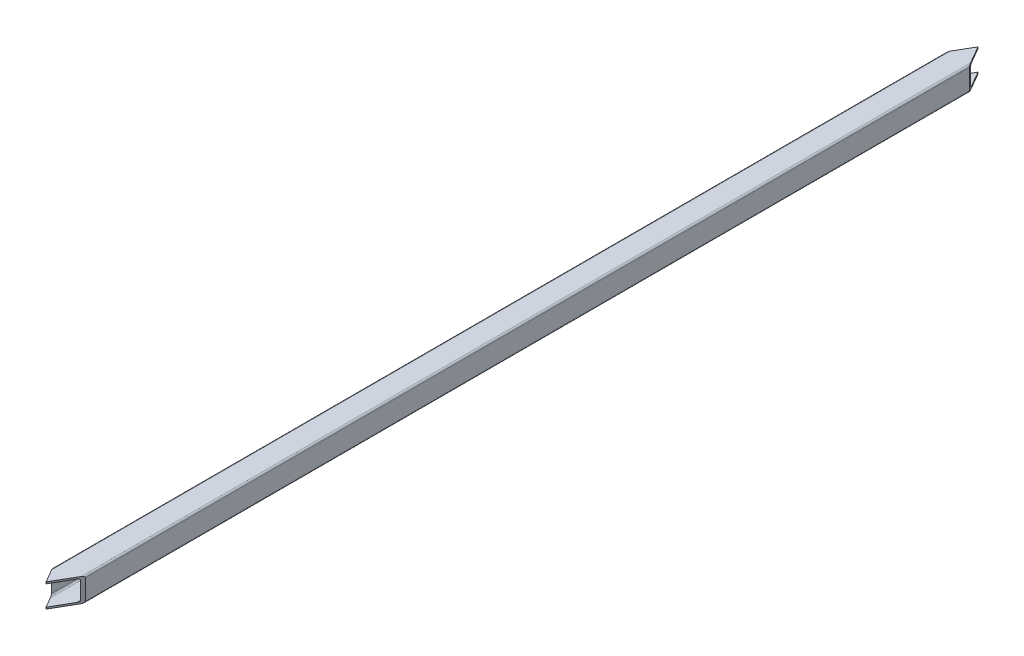
ISO-10303-21;
HEADER;
FILE_DESCRIPTION(('STEP AP214'),'2;1');
FILE_NAME('part.step','',(''),(''),'','','');
FILE_SCHEMA(('AUTOMOTIVE_DESIGN { 1 0 10303 214 1 1 1 1 }'));
ENDSEC;
DATA;
#1=APPLICATION_CONTEXT('core data for automotive mechanical design processes');
#2=APPLICATION_PROTOCOL_DEFINITION('international standard','automotive_design',2000,#1);
#3=PRODUCT_CONTEXT('',#1,'mechanical');
#4=PRODUCT('Part','Part','',(#3));
#5=PRODUCT_RELATED_PRODUCT_CATEGORY('part','',(#4));
#6=PRODUCT_DEFINITION_FORMATION('','',#4);
#7=PRODUCT_DEFINITION_CONTEXT('part definition',#1,'design');
#8=PRODUCT_DEFINITION('design','',#6,#7);
#9=PRODUCT_DEFINITION_SHAPE('','',#8);
#10=(LENGTH_UNIT() NAMED_UNIT(*) SI_UNIT(.MILLI.,.METRE.));
#11=(NAMED_UNIT(*) PLANE_ANGLE_UNIT() SI_UNIT($,.RADIAN.));
#12=(NAMED_UNIT(*) SI_UNIT($,.STERADIAN.) SOLID_ANGLE_UNIT());
#13=UNCERTAINTY_MEASURE_WITH_UNIT(LENGTH_MEASURE(1.E-05),#10,'distance_accuracy_value','');
#14=(GEOMETRIC_REPRESENTATION_CONTEXT(3) GLOBAL_UNCERTAINTY_ASSIGNED_CONTEXT((#13)) GLOBAL_UNIT_ASSIGNED_CONTEXT((#10,
#11,#12)) REPRESENTATION_CONTEXT('',''));
#15=CARTESIAN_POINT('',(0.,0.,0.));
#16=DIRECTION('',(0.,0.,1.));
#17=DIRECTION('',(1.,0.,0.));
#18=AXIS2_PLACEMENT_3D('',#15,#16,#17);
#19=CARTESIAN_POINT('',(2.54,-35.56,1500.));
#20=DIRECTION('',(0.,0.,-1.));
#21=DIRECTION('',(-1.,0.,0.));
#22=AXIS2_PLACEMENT_3D('',#19,#20,#21);
#23=CYLINDRICAL_SURFACE('',#22,2.54);
#24=DIRECTION('',(0.,0.,-1.));
#25=VECTOR('',#24,1.);
#26=CARTESIAN_POINT('',(0.,-35.56,1500.));
#27=LINE('',#26,#25);
#28=CARTESIAN_POINT('',(0.,-35.56,1474.28745610827));
#29=VERTEX_POINT('',#28);
#30=CARTESIAN_POINT('',(0.,-35.56,32.9955678841869));
#31=VERTEX_POINT('',#30);
#32=EDGE_CURVE('E229',#29,#31,#27,.T.);
#33=ORIENTED_EDGE('',*,*,#32,.T.);
#34=CARTESIAN_POINT('',(2.54,-35.56,28.5961588329622));
#35=DIRECTION('',(0.866025403784437,0.,0.500000000000003));
#36=DIRECTION('',(0.500000000000003,0.,-0.866025403784437));
#37=AXIS2_PLACEMENT_3D('',#34,#35,#36);
#38=ELLIPSE('',#37,5.07999999999998,2.54);
#39=CARTESIAN_POINT('',(2.5400000000001,-38.1,28.5961588329617));
#40=VERTEX_POINT('',#39);
#41=EDGE_CURVE('E261',#31,#40,#38,.T.);
#42=ORIENTED_EDGE('',*,*,#41,.T.);
#43=DIRECTION('',(0.,0.,-1.));
#44=VECTOR('',#43,1.);
#45=CARTESIAN_POINT('',(2.54000000000002,-38.1,1500.));
#46=LINE('',#45,#44);
#47=CARTESIAN_POINT('',(2.54000000000007,-38.1,1478.6868651595));
#48=VERTEX_POINT('',#47);
#49=EDGE_CURVE('E244',#48,#40,#46,.T.);
#50=ORIENTED_EDGE('',*,*,#49,.F.);
#51=CARTESIAN_POINT('',(2.54,-35.56,1478.6868651595));
#52=DIRECTION('',(0.866025403784442,0.,-0.499999999999995));
#53=DIRECTION('',(-0.499999999999995,0.,-0.866025403784442));
#54=AXIS2_PLACEMENT_3D('',#51,#52,#53);
#55=ELLIPSE('',#54,5.08000000000005,2.54);
#56=EDGE_CURVE('E259',#48,#29,#55,.T.);
#57=ORIENTED_EDGE('',*,*,#56,.T.);
#58=EDGE_LOOP('',(#33,#42,#50,#57));
#59=FACE_BOUND('',#58,.T.);
#60=ADVANCED_FACE('F33',(#59),#23,.T.);
#61=CARTESIAN_POINT('',(2.54000000000002,-38.1,1500.));
#62=DIRECTION('',(0.,1.,0.));
#63=DIRECTION('',(0.,0.,1.));
#64=AXIS2_PLACEMENT_3D('',#61,#62,#63);
#65=PLANE('',#64);
#66=ORIENTED_EDGE('',*,*,#49,.T.);
#67=DIRECTION('',(0.500000000000003,0.,-0.866025403784437));
#68=VECTOR('',#67,1.);
#69=CARTESIAN_POINT('',(-634.596552838331,-38.1,1132.14903970824));
#70=LINE('',#69,#68);
#71=CARTESIAN_POINT('',(19.05,-38.1,0.));
#72=VERTEX_POINT('',#71);
#73=EDGE_CURVE('E252',#40,#72,#70,.T.);
#74=ORIENTED_EDGE('',*,*,#73,.T.);
#75=DIRECTION('',(0.499999999999995,0.,0.866025403784441));
#76=VECTOR('',#75,1.);
#77=CARTESIAN_POINT('',(19.05,-38.1,0.));
#78=LINE('',#77,#76);
#79=CARTESIAN_POINT('',(35.56,-38.1,28.5961588329625));
#80=VERTEX_POINT('',#79);
#81=EDGE_CURVE('E192',#72,#80,#78,.T.);
#82=ORIENTED_EDGE('',*,*,#81,.T.);
#83=DIRECTION('',(0.,0.,-1.));
#84=VECTOR('',#83,1.);
#85=CARTESIAN_POINT('',(35.56,-38.1,1500.));
#86=LINE('',#85,#84);
#87=CARTESIAN_POINT('',(35.56,-38.1,1464.12081717458));
#88=VERTEX_POINT('',#87);
#89=EDGE_CURVE('E242',#88,#80,#86,.T.);
#90=ORIENTED_EDGE('',*,*,#89,.F.);
#91=DIRECTION('',(-0.500000000000003,0.,0.866025403784437));
#92=VECTOR('',#91,1.);
#93=CARTESIAN_POINT('',(11.7688581030787,-38.1,1505.32828371013));
#94=LINE('',#93,#92);
#95=CARTESIAN_POINT('',(14.8451441374381,-38.1,1500.));
#96=VERTEX_POINT('',#95);
#97=EDGE_CURVE('E288',#88,#96,#94,.T.);
#98=ORIENTED_EDGE('',*,*,#97,.T.);
#99=DIRECTION('',(-0.499999999999995,0.,-0.866025403784442));
#100=VECTOR('',#99,1.);
#101=CARTESIAN_POINT('',(0.,-38.1,1474.28745610827));
#102=LINE('',#101,#100);
#103=EDGE_CURVE('E255',#96,#48,#102,.T.);
#104=ORIENTED_EDGE('',*,*,#103,.T.);
#105=EDGE_LOOP('',(#66,#74,#82,#90,#98,#104));
#106=FACE_BOUND('',#105,.T.);
#107=ADVANCED_FACE('F250',(#106),#65,.F.);
#108=CARTESIAN_POINT('',(35.56,-35.56,1500.));
#109=DIRECTION('',(0.,0.,-1.));
#110=DIRECTION('',(-1.,0.,0.));
#111=AXIS2_PLACEMENT_3D('',#108,#109,#110);
#112=CYLINDRICAL_SURFACE('',#111,2.54);
#113=DIRECTION('',(0.,0.,-1.));
#114=VECTOR('',#113,1.);
#115=CARTESIAN_POINT('',(38.1,-35.56,1500.));
#116=LINE('',#115,#114);
#117=CARTESIAN_POINT('',(38.0999999999999,-35.56,1459.72140812335));
#118=VERTEX_POINT('',#117);
#119=CARTESIAN_POINT('',(38.1,-35.56,32.9955678841876));
#120=VERTEX_POINT('',#119);
#121=EDGE_CURVE('E240',#118,#120,#116,.T.);
#122=ORIENTED_EDGE('',*,*,#121,.F.);
#123=CARTESIAN_POINT('',(35.56,-35.56,1464.12081717458));
#124=DIRECTION('',(-0.866025403784437,0.,-0.500000000000003));
#125=DIRECTION('',(0.500000000000003,0.,-0.866025403784437));
#126=AXIS2_PLACEMENT_3D('',#123,#124,#125);
#127=ELLIPSE('',#126,5.07999999999997,2.54);
#128=EDGE_CURVE('E285',#118,#88,#127,.T.);
#129=ORIENTED_EDGE('',*,*,#128,.T.);
#130=ORIENTED_EDGE('',*,*,#89,.T.);
#131=CARTESIAN_POINT('',(35.56,-35.56,28.5961588329626));
#132=DIRECTION('',(-0.866025403784442,0.,0.499999999999995));
#133=DIRECTION('',(-0.499999999999995,0.,-0.866025403784442));
#134=AXIS2_PLACEMENT_3D('',#131,#132,#133);
#135=ELLIPSE('',#134,5.08000000000005,2.54);
#136=EDGE_CURVE('E201',#80,#120,#135,.T.);
#137=ORIENTED_EDGE('',*,*,#136,.T.);
#138=EDGE_LOOP('',(#122,#129,#130,#137));
#139=FACE_BOUND('',#138,.T.);
#140=ADVANCED_FACE('F367',(#139),#112,.T.);
#141=CARTESIAN_POINT('',(38.1,-2.54000000000002,1500.));
#142=DIRECTION('',(-1.,0.,0.));
#143=DIRECTION('',(0.,-1.,0.));
#144=AXIS2_PLACEMENT_3D('',#141,#142,#143);
#145=PLANE('',#144);
#146=DIRECTION('',(0.,0.,-1.));
#147=VECTOR('',#146,1.);
#148=CARTESIAN_POINT('',(38.1,-2.54000000000002,1500.));
#149=LINE('',#148,#147);
#150=CARTESIAN_POINT('',(38.1,-2.54,1459.72140812335));
#151=VERTEX_POINT('',#150);
#152=CARTESIAN_POINT('',(38.1,-2.54,32.9955678841876));
#153=VERTEX_POINT('',#152);
#154=EDGE_CURVE('E238',#151,#153,#149,.T.);
#155=ORIENTED_EDGE('',*,*,#154,.F.);
#156=DIRECTION('',(0.,-1.,0.));
#157=VECTOR('',#156,1.);
#158=CARTESIAN_POINT('',(38.0999999999999,0.,1459.72140812335));
#159=LINE('',#158,#157);
#160=EDGE_CURVE('E265',#151,#118,#159,.T.);
#161=ORIENTED_EDGE('',*,*,#160,.T.);
#162=ORIENTED_EDGE('',*,*,#121,.T.);
#163=DIRECTION('',(0.,1.,0.));
#164=VECTOR('',#163,1.);
#165=CARTESIAN_POINT('',(38.1,-38.1,32.9955678841876));
#166=LINE('',#165,#164);
#167=EDGE_CURVE('E314',#120,#153,#166,.T.);
#168=ORIENTED_EDGE('',*,*,#167,.T.);
#169=EDGE_LOOP('',(#155,#161,#162,#168));
#170=FACE_BOUND('',#169,.T.);
#171=ADVANCED_FACE('F364',(#170),#145,.F.);
#172=CARTESIAN_POINT('',(35.56,-2.54,1500.));
#173=DIRECTION('',(0.,0.,-1.));
#174=DIRECTION('',(-1.,0.,0.));
#175=AXIS2_PLACEMENT_3D('',#172,#173,#174);
#176=CYLINDRICAL_SURFACE('',#175,2.54);
#177=DIRECTION('',(0.,0.,-1.));
#178=VECTOR('',#177,1.);
#179=CARTESIAN_POINT('',(35.56,0.,1500.));
#180=LINE('',#179,#178);
#181=CARTESIAN_POINT('',(35.5599999999996,0.,1464.12081717458));
#182=VERTEX_POINT('',#181);
#183=CARTESIAN_POINT('',(35.5599999999999,0.,28.5961588329622));
#184=VERTEX_POINT('',#183);
#185=EDGE_CURVE('E197',#182,#184,#180,.T.);
#186=ORIENTED_EDGE('',*,*,#185,.F.);
#187=CARTESIAN_POINT('',(35.56,-2.54,1464.12081717458));
#188=DIRECTION('',(-0.866025403784437,0.,-0.500000000000003));
#189=DIRECTION('',(0.500000000000003,0.,-0.866025403784437));
#190=AXIS2_PLACEMENT_3D('',#187,#188,#189);
#191=ELLIPSE('',#190,5.07999999999997,2.54);
#192=EDGE_CURVE('E282',#182,#151,#191,.T.);
#193=ORIENTED_EDGE('',*,*,#192,.T.);
#194=ORIENTED_EDGE('',*,*,#154,.T.);
#195=CARTESIAN_POINT('',(35.56,-2.54,28.5961588329626));
#196=DIRECTION('',(-0.866025403784442,0.,0.499999999999995));
#197=DIRECTION('',(-0.499999999999995,0.,-0.866025403784442));
#198=AXIS2_PLACEMENT_3D('',#195,#196,#197);
#199=ELLIPSE('',#198,5.08000000000005,2.54);
#200=EDGE_CURVE('E198',#153,#184,#199,.T.);
#201=ORIENTED_EDGE('',*,*,#200,.T.);
#202=EDGE_LOOP('',(#186,#193,#194,#201));
#203=FACE_BOUND('',#202,.T.);
#204=ADVANCED_FACE('F359',(#203),#176,.T.);
#205=CARTESIAN_POINT('',(2.54000000000002,0.,1500.));
#206=DIRECTION('',(0.,-1.,0.));
#207=DIRECTION('',(0.,0.,-1.));
#208=AXIS2_PLACEMENT_3D('',#205,#206,#207);
#209=PLANE('',#208);
#210=DIRECTION('',(-0.499999999999995,0.,-0.866025403784442));
#211=VECTOR('',#210,1.);
#212=CARTESIAN_POINT('',(664.441552838325,0.,1117.85096029177));
#213=LINE('',#212,#211);
#214=CARTESIAN_POINT('',(19.05,0.,0.));
#215=VERTEX_POINT('',#214);
#216=EDGE_CURVE('E188',#184,#215,#213,.T.);
#217=ORIENTED_EDGE('',*,*,#216,.T.);
#218=DIRECTION('',(-0.500000000000003,0.,0.866025403784437));
#219=VECTOR('',#218,1.);
#220=CARTESIAN_POINT('',(14.2875,0.,8.24889197104681));
#221=LINE('',#220,#219);
#222=CARTESIAN_POINT('',(2.54000000000011,0.,28.5961588329616));
#223=VERTEX_POINT('',#222);
#224=EDGE_CURVE('E169',#215,#223,#221,.T.);
#225=ORIENTED_EDGE('',*,*,#224,.T.);
#226=DIRECTION('',(0.,0.,-1.));
#227=VECTOR('',#226,1.);
#228=CARTESIAN_POINT('',(2.54000000000002,0.,1500.));
#229=LINE('',#228,#227);
#230=CARTESIAN_POINT('',(2.54000000000002,0.,1478.6868651595));
#231=VERTEX_POINT('',#230);
#232=EDGE_CURVE('E235',#231,#223,#229,.T.);
#233=ORIENTED_EDGE('',*,*,#232,.F.);
#234=DIRECTION('',(0.499999999999995,0.,0.866025403784442));
#235=VECTOR('',#234,1.);
#236=CARTESIAN_POINT('',(11.7688581030787,0.,1494.67171628987));
#237=LINE('',#236,#235);
#238=CARTESIAN_POINT('',(14.8451441374382,0.,1500.));
#239=VERTEX_POINT('',#238);
#240=EDGE_CURVE('E309',#231,#239,#237,.T.);
#241=ORIENTED_EDGE('',*,*,#240,.T.);
#242=DIRECTION('',(0.500000000000003,0.,-0.866025403784437));
#243=VECTOR('',#242,1.);
#244=CARTESIAN_POINT('',(660.65291094141,0.,381.428135972936));
#245=LINE('',#244,#243);
#246=EDGE_CURVE('E263',#239,#182,#245,.T.);
#247=ORIENTED_EDGE('',*,*,#246,.T.);
#248=ORIENTED_EDGE('',*,*,#185,.T.);
#249=EDGE_LOOP('',(#217,#225,#233,#241,#247,#248));
#250=FACE_BOUND('',#249,.T.);
#251=ADVANCED_FACE('F194',(#250),#209,.F.);
#252=CARTESIAN_POINT('',(2.54,-2.54,1500.));
#253=DIRECTION('',(0.,0.,-1.));
#254=DIRECTION('',(-1.,0.,0.));
#255=AXIS2_PLACEMENT_3D('',#252,#253,#254);
#256=CYLINDRICAL_SURFACE('',#255,2.54);
#257=ORIENTED_EDGE('',*,*,#232,.T.);
#258=CARTESIAN_POINT('',(2.54,-2.54,28.5961588329622));
#259=DIRECTION('',(0.866025403784437,0.,0.500000000000003));
#260=DIRECTION('',(0.500000000000003,0.,-0.866025403784437));
#261=AXIS2_PLACEMENT_3D('',#258,#259,#260);
#262=ELLIPSE('',#261,5.07999999999997,2.54);
#263=CARTESIAN_POINT('',(0.,-2.54000000000002,32.9955678841869));
#264=VERTEX_POINT('',#263);
#265=EDGE_CURVE('E175',#223,#264,#262,.T.);
#266=ORIENTED_EDGE('',*,*,#265,.T.);
#267=DIRECTION('',(0.,0.,-1.));
#268=VECTOR('',#267,1.);
#269=CARTESIAN_POINT('',(0.,-2.54000000000002,1500.));
#270=LINE('',#269,#268);
#271=CARTESIAN_POINT('',(0.,-2.54000000000004,1474.28745610827));
#272=VERTEX_POINT('',#271);
#273=EDGE_CURVE('E232',#272,#264,#270,.T.);
#274=ORIENTED_EDGE('',*,*,#273,.F.);
#275=CARTESIAN_POINT('',(2.54,-2.54,1478.6868651595));
#276=DIRECTION('',(0.866025403784442,0.,-0.499999999999995));
#277=DIRECTION('',(-0.499999999999995,0.,-0.866025403784442));
#278=AXIS2_PLACEMENT_3D('',#275,#276,#277);
#279=ELLIPSE('',#278,5.08000000000005,2.54);
#280=EDGE_CURVE('E306',#272,#231,#279,.T.);
#281=ORIENTED_EDGE('',*,*,#280,.T.);
#282=EDGE_LOOP('',(#257,#266,#274,#281));
#283=FACE_BOUND('',#282,.T.);
#284=ADVANCED_FACE('F352',(#283),#256,.T.);
#285=CARTESIAN_POINT('',(0.,-2.54000000000002,1500.));
#286=DIRECTION('',(1.,0.,0.));
#287=DIRECTION('',(0.,1.,0.));
#288=AXIS2_PLACEMENT_3D('',#285,#286,#287);
#289=PLANE('',#288);
#290=ORIENTED_EDGE('',*,*,#273,.T.);
#291=DIRECTION('',(0.,-1.,0.));
#292=VECTOR('',#291,1.);
#293=CARTESIAN_POINT('',(0.,0.,32.9955678841869));
#294=LINE('',#293,#292);
#295=EDGE_CURVE('E180',#264,#31,#294,.T.);
#296=ORIENTED_EDGE('',*,*,#295,.T.);
#297=ORIENTED_EDGE('',*,*,#32,.F.);
#298=DIRECTION('',(0.,1.,0.));
#299=VECTOR('',#298,1.);
#300=CARTESIAN_POINT('',(0.,-38.1,1474.28745610827));
#301=LINE('',#300,#299);
#302=EDGE_CURVE('E292',#29,#272,#301,.T.);
#303=ORIENTED_EDGE('',*,*,#302,.T.);
#304=EDGE_LOOP('',(#290,#296,#297,#303));
#305=FACE_BOUND('',#304,.T.);
#306=ADVANCED_FACE('F354',(#305),#289,.F.);
#307=CARTESIAN_POINT('',(5.3086,-32.7914,1500.));
#308=DIRECTION('',(0.,0.,-1.));
#309=DIRECTION('',(-1.,0.,0.));
#310=AXIS2_PLACEMENT_3D('',#307,#308,#309);
#311=CYLINDRICAL_SURFACE('',#310,2.54);
#312=CARTESIAN_POINT('',(5.3086,-32.7914,23.8008029671268));
#313=DIRECTION('',(0.866025403784437,0.,0.500000000000003));
#314=DIRECTION('',(0.500000000000003,0.,-0.866025403784437));
#315=AXIS2_PLACEMENT_3D('',#312,#313,#314);
#316=ELLIPSE('',#315,5.07999999999998,2.54);
#317=CARTESIAN_POINT('',(2.7686,-32.7914,28.2002120183518));
#318=VERTEX_POINT('',#317);
#319=CARTESIAN_POINT('',(5.30860000000002,-35.3314,23.8008029671268));
#320=VERTEX_POINT('',#319);
#321=EDGE_CURVE('E341',#318,#320,#316,.T.);
#322=ORIENTED_EDGE('',*,*,#321,.F.);
#323=DIRECTION('',(0.,0.,-1.));
#324=VECTOR('',#323,1.);
#325=CARTESIAN_POINT('',(2.7686,-32.7914,1500.));
#326=LINE('',#325,#324);
#327=CARTESIAN_POINT('',(2.7686,-32.7914,1479.08281197411));
#328=VERTEX_POINT('',#327);
#329=EDGE_CURVE('E210',#328,#318,#326,.T.);
#330=ORIENTED_EDGE('',*,*,#329,.F.);
#331=CARTESIAN_POINT('',(5.3086,-32.7914,1483.48222102533));
#332=DIRECTION('',(0.866025403784442,0.,-0.499999999999995));
#333=DIRECTION('',(-0.499999999999995,0.,-0.866025403784442));
#334=AXIS2_PLACEMENT_3D('',#331,#332,#333);
#335=ELLIPSE('',#334,5.08000000000005,2.54);
#336=CARTESIAN_POINT('',(5.30860000000002,-35.3314,1483.48222102533));
#337=VERTEX_POINT('',#336);
#338=EDGE_CURVE('E46',#337,#328,#335,.T.);
#339=ORIENTED_EDGE('',*,*,#338,.F.);
#340=DIRECTION('',(0.,0.,-1.));
#341=VECTOR('',#340,1.);
#342=CARTESIAN_POINT('',(5.30860000000002,-35.3314,1500.));
#343=LINE('',#342,#341);
#344=EDGE_CURVE('E226',#337,#320,#343,.T.);
#345=ORIENTED_EDGE('',*,*,#344,.T.);
#346=EDGE_LOOP('',(#322,#330,#339,#345));
#347=FACE_BOUND('',#346,.T.);
#348=ADVANCED_FACE('F377',(#347),#311,.F.);
#349=CARTESIAN_POINT('',(5.30860000000002,-35.3314,1500.));
#350=DIRECTION('',(0.,1.,0.));
#351=DIRECTION('',(0.,0.,1.));
#352=AXIS2_PLACEMENT_3D('',#349,#350,#351);
#353=PLANE('',#352);
#354=DIRECTION('',(0.500000000000003,0.,-0.866025403784437));
#355=VECTOR('',#354,1.);
#356=CARTESIAN_POINT('',(-633.904402838331,-35.3314,1130.95020074178));
#357=LINE('',#356,#355);
#358=CARTESIAN_POINT('',(19.05,-35.3314,0.));
#359=VERTEX_POINT('',#358);
#360=EDGE_CURVE('E344',#320,#359,#357,.T.);
#361=ORIENTED_EDGE('',*,*,#360,.F.);
#362=ORIENTED_EDGE('',*,*,#344,.F.);
#363=DIRECTION('',(-0.499999999999995,0.,-0.866025403784442));
#364=VECTOR('',#363,1.);
#365=CARTESIAN_POINT('',(12.4610081030787,-35.3314,1495.87055525633));
#366=LINE('',#365,#364);
#367=CARTESIAN_POINT('',(14.8451441374381,-35.3314,1500.));
#368=VERTEX_POINT('',#367);
#369=EDGE_CURVE('E304',#368,#337,#366,.T.);
#370=ORIENTED_EDGE('',*,*,#369,.F.);
#371=DIRECTION('',(-0.500000000000003,0.,0.866025403784437));
#372=VECTOR('',#371,1.);
#373=CARTESIAN_POINT('',(12.4610081030786,-35.3314,1504.12944474367));
#374=LINE('',#373,#372);
#375=CARTESIAN_POINT('',(32.7914,-35.3314,1468.91617304041));
#376=VERTEX_POINT('',#375);
#377=EDGE_CURVE('E280',#376,#368,#374,.T.);
#378=ORIENTED_EDGE('',*,*,#377,.F.);
#379=DIRECTION('',(0.,0.,-1.));
#380=VECTOR('',#379,1.);
#381=CARTESIAN_POINT('',(32.7914,-35.3314,1500.));
#382=LINE('',#381,#380);
#383=CARTESIAN_POINT('',(32.7914,-35.3314,23.8008029671275));
#384=VERTEX_POINT('',#383);
#385=EDGE_CURVE('E224',#376,#384,#382,.T.);
#386=ORIENTED_EDGE('',*,*,#385,.T.);
#387=DIRECTION('',(0.499999999999995,0.,0.866025403784442));
#388=VECTOR('',#387,1.);
#389=CARTESIAN_POINT('',(665.133702838325,-35.3314,1119.04979925823));
#390=LINE('',#389,#388);
#391=EDGE_CURVE('E199',#359,#384,#390,.T.);
#392=ORIENTED_EDGE('',*,*,#391,.F.);
#393=EDGE_LOOP('',(#361,#362,#370,#378,#386,#392));
#394=FACE_BOUND('',#393,.T.);
#395=ADVANCED_FACE('F374',(#394),#353,.T.);
#396=CARTESIAN_POINT('',(32.7914,-32.7914,1500.));
#397=DIRECTION('',(0.,0.,-1.));
#398=DIRECTION('',(-1.,0.,0.));
#399=AXIS2_PLACEMENT_3D('',#396,#397,#398);
#400=CYLINDRICAL_SURFACE('',#399,2.54);
#401=CARTESIAN_POINT('',(32.7914,-32.7914,1468.91617304041));
#402=DIRECTION('',(-0.866025403784437,0.,-0.500000000000003));
#403=DIRECTION('',(0.500000000000003,0.,-0.866025403784437));
#404=AXIS2_PLACEMENT_3D('',#401,#402,#403);
#405=ELLIPSE('',#404,5.07999999999997,2.54);
#406=CARTESIAN_POINT('',(35.3314,-32.7914,1464.51676398919));
#407=VERTEX_POINT('',#406);
#408=EDGE_CURVE('E278',#407,#376,#405,.T.);
#409=ORIENTED_EDGE('',*,*,#408,.F.);
#410=DIRECTION('',(0.,0.,-1.));
#411=VECTOR('',#410,1.);
#412=CARTESIAN_POINT('',(35.3314,-32.7914,1500.));
#413=LINE('',#412,#411);
#414=CARTESIAN_POINT('',(35.3314,-32.7914,28.2002120183524));
#415=VERTEX_POINT('',#414);
#416=EDGE_CURVE('E222',#407,#415,#413,.T.);
#417=ORIENTED_EDGE('',*,*,#416,.T.);
#418=CARTESIAN_POINT('',(32.7914,-32.7914,23.8008029671275));
#419=DIRECTION('',(-0.866025403784442,0.,0.499999999999995));
#420=DIRECTION('',(-0.499999999999995,0.,-0.866025403784442));
#421=AXIS2_PLACEMENT_3D('',#418,#419,#420);
#422=ELLIPSE('',#421,5.08000000000005,2.54);
#423=EDGE_CURVE('E204',#384,#415,#422,.T.);
#424=ORIENTED_EDGE('',*,*,#423,.F.);
#425=ORIENTED_EDGE('',*,*,#385,.F.);
#426=EDGE_LOOP('',(#409,#417,#424,#425));
#427=FACE_BOUND('',#426,.T.);
#428=ADVANCED_FACE('F388',(#427),#400,.F.);
#429=CARTESIAN_POINT('',(35.3314,-5.30860000000002,1500.));
#430=DIRECTION('',(-1.,0.,0.));
#431=DIRECTION('',(0.,0.,1.));
#432=AXIS2_PLACEMENT_3D('',#429,#430,#431);
#433=PLANE('',#432);
#434=DIRECTION('',(0.,-1.,0.));
#435=VECTOR('',#434,1.);
#436=CARTESIAN_POINT('',(35.3314,-5.30860000000002,1464.51676398919));
#437=LINE('',#436,#435);
#438=CARTESIAN_POINT('',(35.3314,-5.30860000000002,1464.51676398919));
#439=VERTEX_POINT('',#438);
#440=EDGE_CURVE('E276',#439,#407,#437,.T.);
#441=ORIENTED_EDGE('',*,*,#440,.F.);
#442=DIRECTION('',(0.,0.,-1.));
#443=VECTOR('',#442,1.);
#444=CARTESIAN_POINT('',(35.3314,-5.30860000000002,1500.));
#445=LINE('',#444,#443);
#446=CARTESIAN_POINT('',(35.3314,-5.30860000000002,28.2002120183524));
#447=VERTEX_POINT('',#446);
#448=EDGE_CURVE('E220',#439,#447,#445,.T.);
#449=ORIENTED_EDGE('',*,*,#448,.T.);
#450=DIRECTION('',(0.,1.,0.));
#451=VECTOR('',#450,1.);
#452=CARTESIAN_POINT('',(35.3314,-5.30860000000002,28.2002120183524));
#453=LINE('',#452,#451);
#454=EDGE_CURVE('E320',#415,#447,#453,.T.);
#455=ORIENTED_EDGE('',*,*,#454,.F.);
#456=ORIENTED_EDGE('',*,*,#416,.F.);
#457=EDGE_LOOP('',(#441,#449,#455,#456));
#458=FACE_BOUND('',#457,.T.);
#459=ADVANCED_FACE('F331',(#458),#433,.T.);
#460=CARTESIAN_POINT('',(32.7914,-5.3086,1500.));
#461=DIRECTION('',(0.,0.,-1.));
#462=DIRECTION('',(-1.,0.,0.));
#463=AXIS2_PLACEMENT_3D('',#460,#461,#462);
#464=CYLINDRICAL_SURFACE('',#463,2.54);
#465=CARTESIAN_POINT('',(32.7914,-5.3086,1468.91617304041));
#466=DIRECTION('',(-0.866025403784437,0.,-0.500000000000003));
#467=DIRECTION('',(0.500000000000003,0.,-0.866025403784437));
#468=AXIS2_PLACEMENT_3D('',#465,#466,#467);
#469=ELLIPSE('',#468,5.07999999999997,2.54);
#470=CARTESIAN_POINT('',(32.7914,-2.7686,1468.91617304041));
#471=VERTEX_POINT('',#470);
#472=EDGE_CURVE('E274',#471,#439,#469,.T.);
#473=ORIENTED_EDGE('',*,*,#472,.F.);
#474=DIRECTION('',(0.,0.,-1.));
#475=VECTOR('',#474,1.);
#476=CARTESIAN_POINT('',(32.7914,-2.7686,1500.));
#477=LINE('',#476,#475);
#478=CARTESIAN_POINT('',(32.7914,-2.7686,23.8008029671273));
#479=VERTEX_POINT('',#478);
#480=EDGE_CURVE('E54',#471,#479,#477,.T.);
#481=ORIENTED_EDGE('',*,*,#480,.T.);
#482=CARTESIAN_POINT('',(32.7914,-5.3086,23.8008029671275));
#483=DIRECTION('',(-0.866025403784442,0.,0.499999999999995));
#484=DIRECTION('',(-0.499999999999995,0.,-0.866025403784442));
#485=AXIS2_PLACEMENT_3D('',#482,#483,#484);
#486=ELLIPSE('',#485,5.08000000000005,2.54);
#487=EDGE_CURVE('E316',#447,#479,#486,.T.);
#488=ORIENTED_EDGE('',*,*,#487,.F.);
#489=ORIENTED_EDGE('',*,*,#448,.F.);
#490=EDGE_LOOP('',(#473,#481,#488,#489));
#491=FACE_BOUND('',#490,.T.);
#492=ADVANCED_FACE('F333',(#491),#464,.F.);
#493=CARTESIAN_POINT('',(5.30860000000002,-2.7686,1500.));
#494=DIRECTION('',(0.,-1.,0.));
#495=DIRECTION('',(0.,0.,-1.));
#496=AXIS2_PLACEMENT_3D('',#493,#494,#495);
#497=PLANE('',#496);
#498=DIRECTION('',(-0.500000000000003,0.,0.866025403784437));
#499=VECTOR('',#498,1.);
#500=CARTESIAN_POINT('',(-633.904402838331,-2.7686,1130.95020074178));
#501=LINE('',#500,#499);
#502=CARTESIAN_POINT('',(19.05,-2.7686,0.));
#503=VERTEX_POINT('',#502);
#504=CARTESIAN_POINT('',(5.30860000000002,-2.7686,23.8008029671268));
#505=VERTEX_POINT('',#504);
#506=EDGE_CURVE('E337',#503,#505,#501,.T.);
#507=ORIENTED_EDGE('',*,*,#506,.F.);
#508=DIRECTION('',(-0.499999999999995,0.,-0.866025403784442));
#509=VECTOR('',#508,1.);
#510=CARTESIAN_POINT('',(665.133702838325,-2.7686,1119.04979925823));
#511=LINE('',#510,#509);
#512=EDGE_CURVE('E40',#479,#503,#511,.T.);
#513=ORIENTED_EDGE('',*,*,#512,.F.);
#514=ORIENTED_EDGE('',*,*,#480,.F.);
#515=DIRECTION('',(0.500000000000003,0.,-0.866025403784437));
#516=VECTOR('',#515,1.);
#517=CARTESIAN_POINT('',(12.4610081030786,-2.7686,1504.12944474367));
#518=LINE('',#517,#516);
#519=CARTESIAN_POINT('',(14.8451441374381,-2.76860000000001,1500.));
#520=VERTEX_POINT('',#519);
#521=EDGE_CURVE('E272',#520,#471,#518,.T.);
#522=ORIENTED_EDGE('',*,*,#521,.F.);
#523=DIRECTION('',(0.499999999999995,0.,0.866025403784442));
#524=VECTOR('',#523,1.);
#525=CARTESIAN_POINT('',(12.4610081030787,-2.7686,1495.87055525633));
#526=LINE('',#525,#524);
#527=CARTESIAN_POINT('',(5.30860000000002,-2.7686,1483.48222102533));
#528=VERTEX_POINT('',#527);
#529=EDGE_CURVE('E300',#528,#520,#526,.T.);
#530=ORIENTED_EDGE('',*,*,#529,.F.);
#531=DIRECTION('',(0.,0.,-1.));
#532=VECTOR('',#531,1.);
#533=CARTESIAN_POINT('',(5.30860000000002,-2.7686,1500.));
#534=LINE('',#533,#532);
#535=EDGE_CURVE('E216',#528,#505,#534,.T.);
#536=ORIENTED_EDGE('',*,*,#535,.T.);
#537=EDGE_LOOP('',(#507,#513,#514,#522,#530,#536));
#538=FACE_BOUND('',#537,.T.);
#539=ADVANCED_FACE('F335',(#538),#497,.T.);
#540=CARTESIAN_POINT('',(5.3086,-5.3086,1500.));
#541=DIRECTION('',(0.,0.,-1.));
#542=DIRECTION('',(-1.,0.,0.));
#543=AXIS2_PLACEMENT_3D('',#540,#541,#542);
#544=CYLINDRICAL_SURFACE('',#543,2.54);
#545=CARTESIAN_POINT('',(5.3086,-5.3086,23.8008029671268));
#546=DIRECTION('',(0.866025403784437,0.,0.500000000000003));
#547=DIRECTION('',(0.500000000000003,0.,-0.866025403784437));
#548=AXIS2_PLACEMENT_3D('',#545,#546,#547);
#549=ELLIPSE('',#548,5.07999999999997,2.54);
#550=CARTESIAN_POINT('',(2.7686,-5.30860000000002,28.2002120183518));
#551=VERTEX_POINT('',#550);
#552=EDGE_CURVE('E342',#505,#551,#549,.T.);
#553=ORIENTED_EDGE('',*,*,#552,.F.);
#554=ORIENTED_EDGE('',*,*,#535,.F.);
#555=CARTESIAN_POINT('',(5.3086,-5.3086,1483.48222102533));
#556=DIRECTION('',(0.866025403784442,0.,-0.499999999999995));
#557=DIRECTION('',(-0.499999999999995,0.,-0.866025403784442));
#558=AXIS2_PLACEMENT_3D('',#555,#556,#557);
#559=ELLIPSE('',#558,5.08000000000005,2.54);
#560=CARTESIAN_POINT('',(2.7686,-5.30860000000002,1479.08281197411));
#561=VERTEX_POINT('',#560);
#562=EDGE_CURVE('E295',#561,#528,#559,.T.);
#563=ORIENTED_EDGE('',*,*,#562,.F.);
#564=DIRECTION('',(0.,0.,-1.));
#565=VECTOR('',#564,1.);
#566=CARTESIAN_POINT('',(2.7686,-5.30860000000002,1500.));
#567=LINE('',#566,#565);
#568=EDGE_CURVE('E213',#561,#551,#567,.T.);
#569=ORIENTED_EDGE('',*,*,#568,.T.);
#570=EDGE_LOOP('',(#553,#554,#563,#569));
#571=FACE_BOUND('',#570,.T.);
#572=ADVANCED_FACE('F385',(#571),#544,.F.);
#573=CARTESIAN_POINT('',(2.7686,-5.30860000000002,1500.));
#574=DIRECTION('',(1.,0.,0.));
#575=DIRECTION('',(0.,0.,-1.));
#576=AXIS2_PLACEMENT_3D('',#573,#574,#575);
#577=PLANE('',#576);
#578=DIRECTION('',(0.,-1.,0.));
#579=VECTOR('',#578,1.);
#580=CARTESIAN_POINT('',(2.7686,-5.30860000000002,28.2002120183518));
#581=LINE('',#580,#579);
#582=EDGE_CURVE('E346',#551,#318,#581,.T.);
#583=ORIENTED_EDGE('',*,*,#582,.F.);
#584=ORIENTED_EDGE('',*,*,#568,.F.);
#585=DIRECTION('',(0.,1.,0.));
#586=VECTOR('',#585,1.);
#587=CARTESIAN_POINT('',(2.7686,-5.30860000000002,1479.08281197411));
#588=LINE('',#587,#586);
#589=EDGE_CURVE('E11',#328,#561,#588,.T.);
#590=ORIENTED_EDGE('',*,*,#589,.F.);
#591=ORIENTED_EDGE('',*,*,#329,.T.);
#592=EDGE_LOOP('',(#583,#584,#590,#591));
#593=FACE_BOUND('',#592,.T.);
#594=ADVANCED_FACE('F381',(#593),#577,.T.);
#595=CARTESIAN_POINT('',(19.05,-38.1,0.));
#596=DIRECTION('',(-0.866025403784442,0.,0.499999999999995));
#597=DIRECTION('',(0.499999999999995,0.,0.866025403784442));
#598=AXIS2_PLACEMENT_3D('',#595,#596,#597);
#599=PLANE('',#598);
#600=ORIENTED_EDGE('',*,*,#81,.F.);
#601=DIRECTION('',(0.,1.,0.));
#602=VECTOR('',#601,1.);
#603=CARTESIAN_POINT('',(19.05,-38.1,0.));
#604=LINE('',#603,#602);
#605=EDGE_CURVE('E191',#72,#359,#604,.T.);
#606=ORIENTED_EDGE('',*,*,#605,.T.);
#607=ORIENTED_EDGE('',*,*,#391,.T.);
#608=ORIENTED_EDGE('',*,*,#423,.T.);
#609=ORIENTED_EDGE('',*,*,#454,.T.);
#610=ORIENTED_EDGE('',*,*,#487,.T.);
#611=ORIENTED_EDGE('',*,*,#512,.T.);
#612=EDGE_CURVE('E172',#503,#215,#604,.T.);
#613=ORIENTED_EDGE('',*,*,#612,.T.);
#614=ORIENTED_EDGE('',*,*,#216,.F.);
#615=ORIENTED_EDGE('',*,*,#200,.F.);
#616=ORIENTED_EDGE('',*,*,#167,.F.);
#617=ORIENTED_EDGE('',*,*,#136,.F.);
#618=EDGE_LOOP('',(#600,#606,#607,#608,#609,#610,#611,#613,#614,#615,#616,#617));
#619=FACE_BOUND('',#618,.T.);
#620=ADVANCED_FACE('F186',(#619),#599,.F.);
#621=CARTESIAN_POINT('',(0.,-38.1,1474.28745610827));
#622=DIRECTION('',(0.866025403784442,0.,-0.499999999999995));
#623=DIRECTION('',(-0.499999999999995,0.,-0.866025403784442));
#624=AXIS2_PLACEMENT_3D('',#621,#622,#623);
#625=PLANE('',#624);
#626=ORIENTED_EDGE('',*,*,#103,.F.);
#627=DIRECTION('',(0.,1.,0.));
#628=VECTOR('',#627,1.);
#629=CARTESIAN_POINT('',(14.8451441374382,-38.1,1500.));
#630=LINE('',#629,#628);
#631=EDGE_CURVE('E296',#96,#368,#630,.T.);
#632=ORIENTED_EDGE('',*,*,#631,.T.);
#633=ORIENTED_EDGE('',*,*,#369,.T.);
#634=ORIENTED_EDGE('',*,*,#338,.T.);
#635=ORIENTED_EDGE('',*,*,#589,.T.);
#636=ORIENTED_EDGE('',*,*,#562,.T.);
#637=ORIENTED_EDGE('',*,*,#529,.T.);
#638=EDGE_CURVE('E291',#520,#239,#630,.T.);
#639=ORIENTED_EDGE('',*,*,#638,.T.);
#640=ORIENTED_EDGE('',*,*,#240,.F.);
#641=ORIENTED_EDGE('',*,*,#280,.F.);
#642=ORIENTED_EDGE('',*,*,#302,.F.);
#643=ORIENTED_EDGE('',*,*,#56,.F.);
#644=EDGE_LOOP('',(#626,#632,#633,#634,#635,#636,#637,#639,#640,#641,#642,#643));
#645=FACE_BOUND('',#644,.T.);
#646=ADVANCED_FACE('F355',(#645),#625,.F.);
#647=CARTESIAN_POINT('',(660.65291094141,0.,381.428135972936));
#648=DIRECTION('',(-0.866025403784437,0.,-0.500000000000003));
#649=DIRECTION('',(-0.500000000000003,0.,0.866025403784437));
#650=AXIS2_PLACEMENT_3D('',#647,#648,#649);
#651=PLANE('',#650);
#652=ORIENTED_EDGE('',*,*,#128,.F.);
#653=ORIENTED_EDGE('',*,*,#160,.F.);
#654=ORIENTED_EDGE('',*,*,#192,.F.);
#655=ORIENTED_EDGE('',*,*,#246,.F.);
#656=ORIENTED_EDGE('',*,*,#638,.F.);
#657=ORIENTED_EDGE('',*,*,#521,.T.);
#658=ORIENTED_EDGE('',*,*,#472,.T.);
#659=ORIENTED_EDGE('',*,*,#440,.T.);
#660=ORIENTED_EDGE('',*,*,#408,.T.);
#661=ORIENTED_EDGE('',*,*,#377,.T.);
#662=ORIENTED_EDGE('',*,*,#631,.F.);
#663=ORIENTED_EDGE('',*,*,#97,.F.);
#664=EDGE_LOOP('',(#652,#653,#654,#655,#656,#657,#658,#659,#660,#661,#662,#663));
#665=FACE_BOUND('',#664,.T.);
#666=ADVANCED_FACE('F389',(#665),#651,.F.);
#667=CARTESIAN_POINT('',(14.2875,0.,8.24889197104681));
#668=DIRECTION('',(0.866025403784437,0.,0.500000000000003));
#669=DIRECTION('',(0.500000000000003,0.,-0.866025403784437));
#670=AXIS2_PLACEMENT_3D('',#667,#668,#669);
#671=PLANE('',#670);
#672=ORIENTED_EDGE('',*,*,#295,.F.);
#673=ORIENTED_EDGE('',*,*,#265,.F.);
#674=ORIENTED_EDGE('',*,*,#224,.F.);
#675=ORIENTED_EDGE('',*,*,#612,.F.);
#676=ORIENTED_EDGE('',*,*,#506,.T.);
#677=ORIENTED_EDGE('',*,*,#552,.T.);
#678=ORIENTED_EDGE('',*,*,#582,.T.);
#679=ORIENTED_EDGE('',*,*,#321,.T.);
#680=ORIENTED_EDGE('',*,*,#360,.T.);
#681=ORIENTED_EDGE('',*,*,#605,.F.);
#682=ORIENTED_EDGE('',*,*,#73,.F.);
#683=ORIENTED_EDGE('',*,*,#41,.F.);
#684=EDGE_LOOP('',(#672,#673,#674,#675,#676,#677,#678,#679,#680,#681,#682,#683));
#685=FACE_BOUND('',#684,.T.);
#686=ADVANCED_FACE('F171',(#685),#671,.F.);
#687=CLOSED_SHELL('',(#60,#107,#140,#171,#204,#251,#284,#306,#348,#395,#428,#459,#492,#539,#572,
#594,#620,#646,#666,#686));
#688=MANIFOLD_SOLID_BREP('B2',#687);
#689=ADVANCED_BREP_SHAPE_REPRESENTATION('',(#18,#688),#14);
#690=SHAPE_DEFINITION_REPRESENTATION(#9,#689);
ENDSEC;
END-ISO-10303-21;
